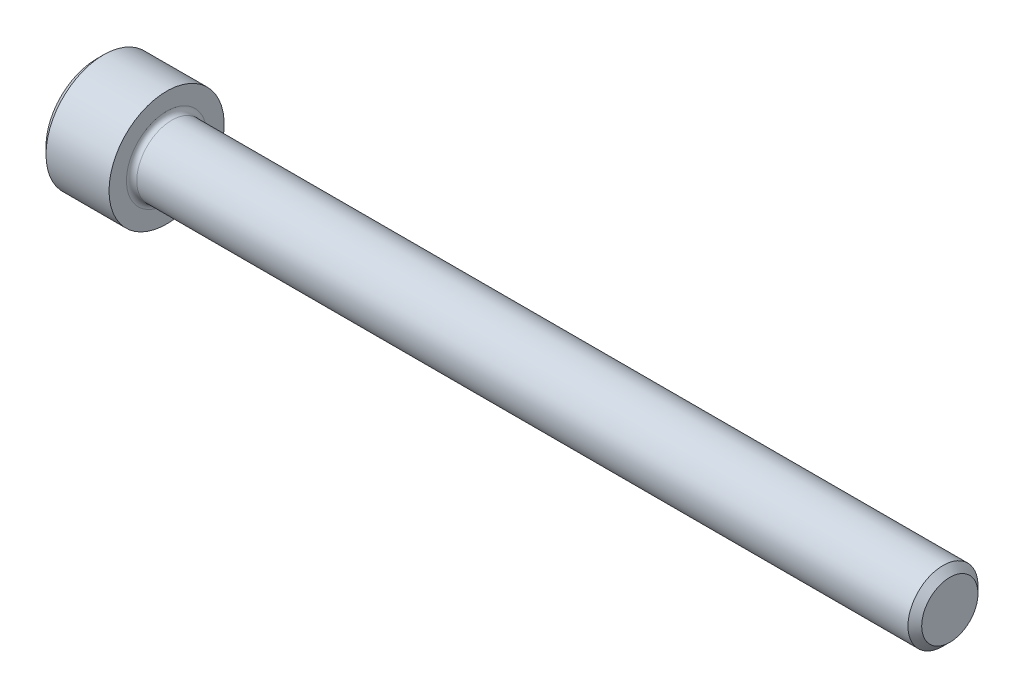
ISO-10303-21;
HEADER;
FILE_DESCRIPTION(('STEP AP214'),'2;1');
FILE_NAME('part.step','',(''),(''),'','','');
FILE_SCHEMA(('AUTOMOTIVE_DESIGN { 1 0 10303 214 1 1 1 1 }'));
ENDSEC;
DATA;
#1=APPLICATION_CONTEXT('core data for automotive mechanical design processes');
#2=APPLICATION_PROTOCOL_DEFINITION('international standard','automotive_design',2000,#1);
#3=PRODUCT_CONTEXT('',#1,'mechanical');
#4=PRODUCT('Part','Part','',(#3));
#5=PRODUCT_RELATED_PRODUCT_CATEGORY('part','',(#4));
#6=PRODUCT_DEFINITION_FORMATION('','',#4);
#7=PRODUCT_DEFINITION_CONTEXT('part definition',#1,'design');
#8=PRODUCT_DEFINITION('design','',#6,#7);
#9=PRODUCT_DEFINITION_SHAPE('','',#8);
#10=(LENGTH_UNIT() NAMED_UNIT(*) SI_UNIT(.MILLI.,.METRE.));
#11=(NAMED_UNIT(*) PLANE_ANGLE_UNIT() SI_UNIT($,.RADIAN.));
#12=(NAMED_UNIT(*) SI_UNIT($,.STERADIAN.) SOLID_ANGLE_UNIT());
#13=UNCERTAINTY_MEASURE_WITH_UNIT(LENGTH_MEASURE(1.E-05),#10,'distance_accuracy_value','');
#14=(GEOMETRIC_REPRESENTATION_CONTEXT(3) GLOBAL_UNCERTAINTY_ASSIGNED_CONTEXT((#13)) GLOBAL_UNIT_ASSIGNED_CONTEXT((#10,
#11,#12)) REPRESENTATION_CONTEXT('',''));
#15=CARTESIAN_POINT('',(0.,0.,0.));
#16=DIRECTION('',(0.,0.,1.));
#17=DIRECTION('',(1.,0.,0.));
#18=AXIS2_PLACEMENT_3D('',#15,#16,#17);
#19=CARTESIAN_POINT('',(2.286,-1.729383501,-1.98501));
#20=DIRECTION('',(-1.,0.,0.));
#21=DIRECTION('',(0.,0.,1.));
#22=AXIS2_PLACEMENT_3D('',#19,#20,#21);
#23=PLANE('',#22);
#24=DIRECTION('',(0.,-0.499999999964279,0.866025403805063));
#25=VECTOR('',#24,1.);
#26=CARTESIAN_POINT('',(2.286,-1.14604605735064,-1.98501));
#27=LINE('',#26,#25);
#28=CARTESIAN_POINT('',(2.286,-1.14604605767532,-1.98501));
#29=VERTEX_POINT('',#28);
#30=CARTESIAN_POINT('',(2.286,-1.71906908660764,-0.99250500002828));
#31=VERTEX_POINT('',#30);
#32=EDGE_CURVE('E20',#29,#31,#27,.T.);
#33=ORIENTED_EDGE('',*,*,#32,.T.);
#34=CARTESIAN_POINT('',(2.286,0.,0.));
#35=DIRECTION('',(-1.,0.,0.));
#36=DIRECTION('',(0.,0.,1.));
#37=AXIS2_PLACEMENT_3D('',#34,#35,#36);
#38=CIRCLE('',#37,1.98501);
#39=CARTESIAN_POINT('',(2.286,-3.81166474394743E-10,-1.98501));
#40=VERTEX_POINT('',#39);
#41=EDGE_CURVE('E87',#40,#31,#38,.T.);
#42=ORIENTED_EDGE('',*,*,#41,.F.);
#43=DIRECTION('',(0.,-1.,0.));
#44=VECTOR('',#43,1.);
#45=CARTESIAN_POINT('',(2.286,-0.859534543,-1.98501));
#46=LINE('',#45,#44);
#47=EDGE_CURVE('E83',#40,#29,#46,.T.);
#48=ORIENTED_EDGE('',*,*,#47,.T.);
#49=EDGE_LOOP('',(#33,#42,#48));
#50=FACE_BOUND('',#49,.T.);
#51=ADVANCED_FACE('F16',(#50),#23,.T.);
#52=CARTESIAN_POINT('',(2.286,-2.295530254,-1.00441506));
#53=DIRECTION('',(-1.,0.,0.));
#54=DIRECTION('',(0.,0.,1.));
#55=AXIS2_PLACEMENT_3D('',#52,#53,#54);
#56=PLANE('',#55);
#57=DIRECTION('',(0.,0.499999999825974,0.866025403884913));
#58=VECTOR('',#57,1.);
#59=CARTESIAN_POINT('',(2.286,-2.29209211568595,0.));
#60=LINE('',#59,#58);
#61=CARTESIAN_POINT('',(2.286,-2.29209211578409,3.39962631627323E-11));
#62=VERTEX_POINT('',#61);
#63=CARTESIAN_POINT('',(2.286,-1.71906908685505,0.992504999599751));
#64=VERTEX_POINT('',#63);
#65=EDGE_CURVE('E108',#62,#64,#60,.T.);
#66=ORIENTED_EDGE('',*,*,#65,.T.);
#67=CARTESIAN_POINT('',(2.286,0.,0.));
#68=DIRECTION('',(-1.,0.,0.));
#69=DIRECTION('',(0.,0.,1.));
#70=AXIS2_PLACEMENT_3D('',#67,#68,#69);
#71=CIRCLE('',#70,1.98501);
#72=EDGE_CURVE('E116',#31,#64,#71,.T.);
#73=ORIENTED_EDGE('',*,*,#72,.F.);
#74=DIRECTION('',(0.,-0.499999999825974,0.866025403884913));
#75=VECTOR('',#74,1.);
#76=CARTESIAN_POINT('',(2.286,-1.71906908731405,-0.992504999507718));
#77=LINE('',#76,#75);
#78=EDGE_CURVE('E106',#31,#62,#77,.T.);
#79=ORIENTED_EDGE('',*,*,#78,.T.);
#80=EDGE_LOOP('',(#66,#73,#79));
#81=FACE_BOUND('',#80,.T.);
#82=ADVANCED_FACE('F235',(#81),#56,.T.);
#83=CARTESIAN_POINT('',(2.286,-1.729383501,0.98654997));
#84=DIRECTION('',(-1.,0.,0.));
#85=DIRECTION('',(0.,0.,1.));
#86=AXIS2_PLACEMENT_3D('',#83,#84,#85);
#87=PLANE('',#86);
#88=DIRECTION('',(0.,1.,0.));
#89=VECTOR('',#88,1.);
#90=CARTESIAN_POINT('',(2.286,-0.859534543,1.98501));
#91=LINE('',#90,#89);
#92=CARTESIAN_POINT('',(2.286,-1.14604605767532,1.98501));
#93=VERTEX_POINT('',#92);
#94=CARTESIAN_POINT('',(2.286,-1.52275368124845E-10,1.98501));
#95=VERTEX_POINT('',#94);
#96=EDGE_CURVE('E114',#93,#95,#91,.T.);
#97=ORIENTED_EDGE('',*,*,#96,.T.);
#98=CARTESIAN_POINT('',(2.286,0.,0.));
#99=DIRECTION('',(-1.,0.,0.));
#100=DIRECTION('',(0.,0.,1.));
#101=AXIS2_PLACEMENT_3D('',#98,#99,#100);
#102=CIRCLE('',#101,1.98501);
#103=EDGE_CURVE('E119',#64,#95,#102,.T.);
#104=ORIENTED_EDGE('',*,*,#103,.F.);
#105=DIRECTION('',(0.,0.499999999964279,0.866025403805063));
#106=VECTOR('',#105,1.);
#107=CARTESIAN_POINT('',(2.286,-1.71906908605193,0.992505000287827));
#108=LINE('',#107,#106);
#109=EDGE_CURVE('E110',#64,#93,#108,.T.);
#110=ORIENTED_EDGE('',*,*,#109,.T.);
#111=EDGE_LOOP('',(#97,#104,#110));
#112=FACE_BOUND('',#111,.T.);
#113=ADVANCED_FACE('F238',(#112),#87,.T.);
#114=CARTESIAN_POINT('',(2.286,-0.010314415,0.98654997));
#115=DIRECTION('',(-1.,0.,0.));
#116=DIRECTION('',(0.,0.,1.));
#117=AXIS2_PLACEMENT_3D('',#114,#115,#116);
#118=PLANE('',#117);
#119=DIRECTION('',(0.,0.499999999964278,-0.866025403805063));
#120=VECTOR('',#119,1.);
#121=CARTESIAN_POINT('',(2.286,1.14604605735064,1.98501));
#122=LINE('',#121,#120);
#123=CARTESIAN_POINT('',(2.286,1.14604605767532,1.98501));
#124=VERTEX_POINT('',#123);
#125=CARTESIAN_POINT('',(2.286,1.71906908660764,0.992505000028279));
#126=VERTEX_POINT('',#125);
#127=EDGE_CURVE('E123',#124,#126,#122,.T.);
#128=ORIENTED_EDGE('',*,*,#127,.T.);
#129=CARTESIAN_POINT('',(2.286,0.,0.));
#130=DIRECTION('',(-1.,0.,0.));
#131=DIRECTION('',(0.,0.,1.));
#132=AXIS2_PLACEMENT_3D('',#129,#130,#131);
#133=CIRCLE('',#132,1.98501);
#134=EDGE_CURVE('E129',#95,#126,#133,.T.);
#135=ORIENTED_EDGE('',*,*,#134,.F.);
#136=DIRECTION('',(0.,1.,0.));
#137=VECTOR('',#136,1.);
#138=CARTESIAN_POINT('',(2.286,0.859534543,1.98501));
#139=LINE('',#138,#137);
#140=EDGE_CURVE('E122',#95,#124,#139,.T.);
#141=ORIENTED_EDGE('',*,*,#140,.T.);
#142=EDGE_LOOP('',(#128,#135,#141));
#143=FACE_BOUND('',#142,.T.);
#144=ADVANCED_FACE('F241',(#143),#118,.T.);
#145=CARTESIAN_POINT('',(2.286,1.715630949,-1.00441506));
#146=DIRECTION('',(-1.,0.,0.));
#147=DIRECTION('',(0.,0.,1.));
#148=AXIS2_PLACEMENT_3D('',#145,#146,#147);
#149=PLANE('',#148);
#150=DIRECTION('',(0.,-0.499999999825974,-0.866025403884913));
#151=VECTOR('',#150,1.);
#152=CARTESIAN_POINT('',(2.286,2.29209211568595,0.));
#153=LINE('',#152,#151);
#154=CARTESIAN_POINT('',(2.286,2.29209211578409,-3.39963652931999E-11));
#155=VERTEX_POINT('',#154);
#156=CARTESIAN_POINT('',(2.286,1.71906908701974,-0.992504999763296));
#157=VERTEX_POINT('',#156);
#158=EDGE_CURVE('E127',#155,#157,#153,.T.);
#159=ORIENTED_EDGE('',*,*,#158,.T.);
#160=CARTESIAN_POINT('',(2.286,0.,0.));
#161=DIRECTION('',(-1.,0.,0.));
#162=DIRECTION('',(0.,0.,1.));
#163=AXIS2_PLACEMENT_3D('',#160,#161,#162);
#164=CIRCLE('',#163,1.98501);
#165=EDGE_CURVE('E132',#126,#157,#164,.T.);
#166=ORIENTED_EDGE('',*,*,#165,.F.);
#167=DIRECTION('',(0.,0.499999999825974,-0.866025403884913));
#168=VECTOR('',#167,1.);
#169=CARTESIAN_POINT('',(2.286,1.71906908731405,0.992504999507718));
#170=LINE('',#169,#168);
#171=EDGE_CURVE('E125',#126,#155,#170,.T.);
#172=ORIENTED_EDGE('',*,*,#171,.T.);
#173=EDGE_LOOP('',(#159,#166,#172));
#174=FACE_BOUND('',#173,.T.);
#175=ADVANCED_FACE('F231',(#174),#149,.T.);
#176=CARTESIAN_POINT('',(3.432046058,0.,0.));
#177=DIRECTION('',(-1.,0.,0.));
#178=DIRECTION('',(0.,0.,1.));
#179=AXIS2_PLACEMENT_3D('',#176,#177,#178);
#180=CONICAL_SURFACE('',#179,0.,1.04719755113769);
#181=CARTESIAN_POINT('',(3.432046058,0.,0.));
#182=VERTEX_POINT('',#181);
#183=VERTEX_LOOP('',#182);
#184=FACE_BOUND('',#183,.T.);
#185=ORIENTED_EDGE('',*,*,#165,.T.);
#186=CARTESIAN_POINT('',(2.286,0.,0.));
#187=DIRECTION('',(-1.,0.,0.));
#188=DIRECTION('',(0.,0.,1.));
#189=AXIS2_PLACEMENT_3D('',#186,#187,#188);
#190=CIRCLE('',#189,1.98501);
#191=EDGE_CURVE('E135',#40,#157,#190,.F.);
#192=ORIENTED_EDGE('',*,*,#191,.F.);
#193=ORIENTED_EDGE('',*,*,#41,.T.);
#194=ORIENTED_EDGE('',*,*,#72,.T.);
#195=ORIENTED_EDGE('',*,*,#103,.T.);
#196=ORIENTED_EDGE('',*,*,#134,.T.);
#197=EDGE_LOOP('',(#185,#192,#193,#194,#195,#196));
#198=FACE_BOUND('',#197,.T.);
#199=ADVANCED_FACE('F227',(#184,#198),#180,.F.);
#200=CARTESIAN_POINT('',(2.286,-0.010314415,-1.98501));
#201=DIRECTION('',(-1.,0.,0.));
#202=DIRECTION('',(0.,0.,1.));
#203=AXIS2_PLACEMENT_3D('',#200,#201,#202);
#204=PLANE('',#203);
#205=DIRECTION('',(0.,-1.,0.));
#206=VECTOR('',#205,1.);
#207=CARTESIAN_POINT('',(2.286,0.,-1.98501));
#208=LINE('',#207,#206);
#209=CARTESIAN_POINT('',(2.286,1.14604605789177,-1.98501));
#210=VERTEX_POINT('',#209);
#211=EDGE_CURVE('E138',#210,#40,#208,.T.);
#212=ORIENTED_EDGE('',*,*,#211,.T.);
#213=ORIENTED_EDGE('',*,*,#191,.T.);
#214=DIRECTION('',(0.,-0.500000000051013,-0.866025403754986));
#215=VECTOR('',#214,1.);
#216=CARTESIAN_POINT('',(2.286,1.719069087,-0.992505));
#217=LINE('',#216,#215);
#218=EDGE_CURVE('E176',#157,#210,#217,.T.);
#219=ORIENTED_EDGE('',*,*,#218,.T.);
#220=EDGE_LOOP('',(#212,#213,#219));
#221=FACE_BOUND('',#220,.T.);
#222=ADVANCED_FACE('F230',(#221),#204,.T.);
#223=CARTESIAN_POINT('',(0.,-1.146046058,-1.98501));
#224=DIRECTION('',(0.,0.,-1.));
#225=DIRECTION('',(0.,1.,0.));
#226=AXIS2_PLACEMENT_3D('',#223,#224,#225);
#227=PLANE('',#226);
#228=ORIENTED_EDGE('',*,*,#47,.F.);
#229=ORIENTED_EDGE('',*,*,#211,.F.);
#230=DIRECTION('',(-1.,0.,0.));
#231=VECTOR('',#230,1.);
#232=CARTESIAN_POINT('',(1.143,1.146046058,-1.98501));
#233=LINE('',#232,#231);
#234=CARTESIAN_POINT('',(0.,1.14604605678512,-1.98501000094996));
#235=VERTEX_POINT('',#234);
#236=EDGE_CURVE('E170',#210,#235,#233,.T.);
#237=ORIENTED_EDGE('',*,*,#236,.T.);
#238=DIRECTION('',(0.,1.,0.));
#239=VECTOR('',#238,1.);
#240=CARTESIAN_POINT('',(0.,0.,-1.9850100020923));
#241=LINE('',#240,#239);
#242=CARTESIAN_POINT('',(0.,-1.14604605678512,-1.98501000094996));
#243=VERTEX_POINT('',#242);
#244=EDGE_CURVE('E97',#243,#235,#241,.T.);
#245=ORIENTED_EDGE('',*,*,#244,.F.);
#246=DIRECTION('',(-1.,0.,0.));
#247=VECTOR('',#246,1.);
#248=CARTESIAN_POINT('',(1.143,-1.146046058,-1.98501));
#249=LINE('',#248,#247);
#250=EDGE_CURVE('E94',#29,#243,#249,.T.);
#251=ORIENTED_EDGE('',*,*,#250,.F.);
#252=EDGE_LOOP('',(#228,#229,#237,#245,#251));
#253=FACE_BOUND('',#252,.T.);
#254=ADVANCED_FACE('F95',(#253),#227,.F.);
#255=CARTESIAN_POINT('',(0.,1.146046058,-1.98501));
#256=DIRECTION('',(0.,0.866025403754987,-0.500000000051013));
#257=DIRECTION('',(0.,0.500000000051013,0.866025403754987));
#258=AXIS2_PLACEMENT_3D('',#255,#256,#257);
#259=PLANE('',#258);
#260=ORIENTED_EDGE('',*,*,#218,.F.);
#261=ORIENTED_EDGE('',*,*,#158,.F.);
#262=DIRECTION('',(1.,0.,0.));
#263=VECTOR('',#262,1.);
#264=CARTESIAN_POINT('',(1.143,2.292092116,0.));
#265=LINE('',#264,#263);
#266=CARTESIAN_POINT('',(0.,2.29209211796823,-3.09916046818681E-10));
#267=VERTEX_POINT('',#266);
#268=EDGE_CURVE('E167',#267,#155,#265,.T.);
#269=ORIENTED_EDGE('',*,*,#268,.F.);
#270=DIRECTION('',(0.,0.500000001278527,0.866025403046281));
#271=VECTOR('',#270,1.);
#272=CARTESIAN_POINT('',(0.,1.14604605590346,-1.9850100020923));
#273=LINE('',#272,#271);
#274=EDGE_CURVE('E139',#235,#267,#273,.T.);
#275=ORIENTED_EDGE('',*,*,#274,.F.);
#276=ORIENTED_EDGE('',*,*,#236,.F.);
#277=EDGE_LOOP('',(#260,#261,#269,#275,#276));
#278=FACE_BOUND('',#277,.T.);
#279=ADVANCED_FACE('F254',(#278),#259,.F.);
#280=CARTESIAN_POINT('',(0.,1.146046058,1.98501));
#281=DIRECTION('',(0.,-0.866025403754987,-0.500000000051013));
#282=DIRECTION('',(0.,0.500000000051013,-0.866025403754987));
#283=AXIS2_PLACEMENT_3D('',#280,#281,#282);
#284=PLANE('',#283);
#285=ORIENTED_EDGE('',*,*,#268,.T.);
#286=ORIENTED_EDGE('',*,*,#171,.F.);
#287=ORIENTED_EDGE('',*,*,#127,.F.);
#288=DIRECTION('',(-1.,0.,0.));
#289=VECTOR('',#288,1.);
#290=CARTESIAN_POINT('',(1.143,1.146046058,1.98501));
#291=LINE('',#290,#289);
#292=CARTESIAN_POINT('',(0.,1.14604605678512,1.98501000094996));
#293=VERTEX_POINT('',#292);
#294=EDGE_CURVE('E162',#124,#293,#291,.T.);
#295=ORIENTED_EDGE('',*,*,#294,.T.);
#296=DIRECTION('',(0.,-0.500000001278527,0.866025403046281));
#297=VECTOR('',#296,1.);
#298=CARTESIAN_POINT('',(0.,2.29209211886288,0.));
#299=LINE('',#298,#297);
#300=EDGE_CURVE('E141',#267,#293,#299,.T.);
#301=ORIENTED_EDGE('',*,*,#300,.F.);
#302=EDGE_LOOP('',(#285,#286,#287,#295,#301));
#303=FACE_BOUND('',#302,.T.);
#304=ADVANCED_FACE('F257',(#303),#284,.T.);
#305=CARTESIAN_POINT('',(0.,1.146046058,1.98501));
#306=DIRECTION('',(0.,0.,1.));
#307=DIRECTION('',(0.,-1.,0.));
#308=AXIS2_PLACEMENT_3D('',#305,#306,#307);
#309=PLANE('',#308);
#310=ORIENTED_EDGE('',*,*,#140,.F.);
#311=ORIENTED_EDGE('',*,*,#96,.F.);
#312=DIRECTION('',(1.,0.,0.));
#313=VECTOR('',#312,1.);
#314=CARTESIAN_POINT('',(1.143,-1.146046058,1.98501));
#315=LINE('',#314,#313);
#316=CARTESIAN_POINT('',(0.,-1.14604605678512,1.98501000094996));
#317=VERTEX_POINT('',#316);
#318=EDGE_CURVE('E101',#317,#93,#315,.T.);
#319=ORIENTED_EDGE('',*,*,#318,.F.);
#320=DIRECTION('',(0.,-1.,0.));
#321=VECTOR('',#320,1.);
#322=CARTESIAN_POINT('',(0.,0.,1.9850100020923));
#323=LINE('',#322,#321);
#324=EDGE_CURVE('E143',#293,#317,#323,.T.);
#325=ORIENTED_EDGE('',*,*,#324,.F.);
#326=ORIENTED_EDGE('',*,*,#294,.F.);
#327=EDGE_LOOP('',(#310,#311,#319,#325,#326));
#328=FACE_BOUND('',#327,.T.);
#329=ADVANCED_FACE('F261',(#328),#309,.F.);
#330=CARTESIAN_POINT('',(0.,-2.292092116,0.));
#331=DIRECTION('',(0.,0.866025403754987,-0.500000000051013));
#332=DIRECTION('',(0.,0.500000000051013,0.866025403754987));
#333=AXIS2_PLACEMENT_3D('',#330,#331,#332);
#334=PLANE('',#333);
#335=ORIENTED_EDGE('',*,*,#318,.T.);
#336=ORIENTED_EDGE('',*,*,#109,.F.);
#337=ORIENTED_EDGE('',*,*,#65,.F.);
#338=DIRECTION('',(1.,0.,0.));
#339=VECTOR('',#338,1.);
#340=CARTESIAN_POINT('',(1.143,-2.292092116,0.));
#341=LINE('',#340,#339);
#342=CARTESIAN_POINT('',(0.,-2.29209211796823,-3.09915573733553E-10));
#343=VERTEX_POINT('',#342);
#344=EDGE_CURVE('E100',#343,#62,#341,.T.);
#345=ORIENTED_EDGE('',*,*,#344,.F.);
#346=DIRECTION('',(0.,-0.500000001278527,-0.866025403046281));
#347=VECTOR('',#346,1.);
#348=CARTESIAN_POINT('',(0.,-1.14604605590346,1.9850100020923));
#349=LINE('',#348,#347);
#350=EDGE_CURVE('E35',#317,#343,#349,.T.);
#351=ORIENTED_EDGE('',*,*,#350,.F.);
#352=EDGE_LOOP('',(#335,#336,#337,#345,#351));
#353=FACE_BOUND('',#352,.T.);
#354=ADVANCED_FACE('F265',(#353),#334,.T.);
#355=CARTESIAN_POINT('',(0.,-1.146046058,-1.98501));
#356=DIRECTION('',(0.,0.866025403754987,0.500000000051013));
#357=DIRECTION('',(0.,-0.500000000051013,0.866025403754987));
#358=AXIS2_PLACEMENT_3D('',#355,#356,#357);
#359=PLANE('',#358);
#360=ORIENTED_EDGE('',*,*,#344,.T.);
#361=ORIENTED_EDGE('',*,*,#78,.F.);
#362=ORIENTED_EDGE('',*,*,#32,.F.);
#363=ORIENTED_EDGE('',*,*,#250,.T.);
#364=DIRECTION('',(0.,0.500000001278527,-0.866025403046281));
#365=VECTOR('',#364,1.);
#366=CARTESIAN_POINT('',(0.,-2.29209211886288,0.));
#367=LINE('',#366,#365);
#368=EDGE_CURVE('E145',#343,#243,#367,.T.);
#369=ORIENTED_EDGE('',*,*,#368,.F.);
#370=EDGE_LOOP('',(#360,#361,#362,#363,#369));
#371=FACE_BOUND('',#370,.T.);
#372=ADVANCED_FACE('F105',(#371),#359,.T.);
#373=CARTESIAN_POINT('',(0.,-3.5279838,-3.5279838));
#374=DIRECTION('',(-1.,0.,0.));
#375=DIRECTION('',(0.,0.,1.));
#376=AXIS2_PLACEMENT_3D('',#373,#374,#375);
#377=PLANE('',#376);
#378=ORIENTED_EDGE('',*,*,#350,.T.);
#379=ORIENTED_EDGE('',*,*,#368,.T.);
#380=ORIENTED_EDGE('',*,*,#244,.T.);
#381=ORIENTED_EDGE('',*,*,#274,.T.);
#382=ORIENTED_EDGE('',*,*,#300,.T.);
#383=ORIENTED_EDGE('',*,*,#324,.T.);
#384=EDGE_LOOP('',(#378,#379,#380,#381,#382,#383));
#385=FACE_BOUND('',#384,.T.);
#386=CARTESIAN_POINT('',(0.,0.,0.));
#387=DIRECTION('',(1.,0.,0.));
#388=DIRECTION('',(0.,0.,-1.));
#389=AXIS2_PLACEMENT_3D('',#386,#387,#388);
#390=CIRCLE('',#389,3.48615);
#391=CARTESIAN_POINT('',(0.,0.,-3.48615));
#392=VERTEX_POINT('',#391);
#393=EDGE_CURVE('E147',#392,#392,#390,.F.);
#394=ORIENTED_EDGE('',*,*,#393,.T.);
#395=EDGE_LOOP('',(#394));
#396=FACE_BOUND('',#395,.T.);
#397=ADVANCED_FACE('F272',(#385,#396),#377,.T.);
#398=CARTESIAN_POINT('',(58.801,-1.96384672,1.96384672));
#399=DIRECTION('',(1.,0.,0.));
#400=DIRECTION('',(0.,0.,-1.));
#401=AXIS2_PLACEMENT_3D('',#398,#399,#400);
#402=PLANE('',#401);
#403=CARTESIAN_POINT('',(58.801,0.,0.));
#404=DIRECTION('',(-1.,0.,0.));
#405=DIRECTION('',(0.,0.,1.));
#406=AXIS2_PLACEMENT_3D('',#403,#404,#405);
#407=CIRCLE('',#406,1.94056);
#408=CARTESIAN_POINT('',(58.801,0.,1.94056));
#409=VERTEX_POINT('',#408);
#410=EDGE_CURVE('E150',#409,#409,#407,.F.);
#411=ORIENTED_EDGE('',*,*,#410,.T.);
#412=EDGE_LOOP('',(#411));
#413=FACE_BOUND('',#412,.T.);
#414=ADVANCED_FACE('F225',(#413),#402,.T.);
#415=CARTESIAN_POINT('',(0.,0.,0.));
#416=DIRECTION('',(1.,0.,0.));
#417=DIRECTION('',(0.,0.,-1.));
#418=AXIS2_PLACEMENT_3D('',#415,#416,#417);
#419=CONICAL_SURFACE('',#418,3.48615,0.785398163397448);
#420=CARTESIAN_POINT('',(0.4826,0.,0.));
#421=DIRECTION('',(-1.,0.,0.));
#422=DIRECTION('',(0.,-1.,0.));
#423=AXIS2_PLACEMENT_3D('',#420,#421,#422);
#424=CIRCLE('',#423,3.96875);
#425=CARTESIAN_POINT('',(0.4826,-3.96875,0.));
#426=VERTEX_POINT('',#425);
#427=EDGE_CURVE('E153',#426,#426,#424,.T.);
#428=ORIENTED_EDGE('',*,*,#427,.T.);
#429=EDGE_LOOP('',(#428));
#430=FACE_BOUND('',#429,.T.);
#431=ORIENTED_EDGE('',*,*,#393,.F.);
#432=EDGE_LOOP('',(#431));
#433=FACE_BOUND('',#432,.T.);
#434=ADVANCED_FACE('F218',(#430,#433),#419,.T.);
#435=CARTESIAN_POINT('',(58.801,0.,0.));
#436=DIRECTION('',(-1.,0.,0.));
#437=DIRECTION('',(0.,0.,1.));
#438=AXIS2_PLACEMENT_3D('',#435,#436,#437);
#439=CONICAL_SURFACE('',#438,1.94056,0.785398163397451);
#440=CARTESIAN_POINT('',(58.32856,0.,0.));
#441=DIRECTION('',(-1.,0.,0.));
#442=DIRECTION('',(0.,-1.,0.));
#443=AXIS2_PLACEMENT_3D('',#440,#441,#442);
#444=CIRCLE('',#443,2.413);
#445=CARTESIAN_POINT('',(58.32856,-2.413,0.));
#446=VERTEX_POINT('',#445);
#447=EDGE_CURVE('E156',#446,#446,#444,.F.);
#448=ORIENTED_EDGE('',*,*,#447,.T.);
#449=EDGE_LOOP('',(#448));
#450=FACE_BOUND('',#449,.T.);
#451=ORIENTED_EDGE('',*,*,#410,.F.);
#452=EDGE_LOOP('',(#451));
#453=FACE_BOUND('',#452,.T.);
#454=ADVANCED_FACE('F210',(#450,#453),#439,.T.);
#455=CARTESIAN_POINT('',(4.826,0.,0.));
#456=DIRECTION('',(-1.,0.,0.));
#457=DIRECTION('',(0.,0.,1.));
#458=AXIS2_PLACEMENT_3D('',#455,#456,#457);
#459=CYLINDRICAL_SURFACE('',#458,3.96875);
#460=ORIENTED_EDGE('',*,*,#427,.F.);
#461=EDGE_LOOP('',(#460));
#462=FACE_BOUND('',#461,.T.);
#463=CARTESIAN_POINT('',(4.826,0.,0.));
#464=DIRECTION('',(-1.,0.,0.));
#465=DIRECTION('',(0.,0.,1.));
#466=AXIS2_PLACEMENT_3D('',#463,#464,#465);
#467=CIRCLE('',#466,3.96875);
#468=CARTESIAN_POINT('',(4.826,0.,3.96875));
#469=VERTEX_POINT('',#468);
#470=EDGE_CURVE('E154',#469,#469,#467,.F.);
#471=ORIENTED_EDGE('',*,*,#470,.F.);
#472=EDGE_LOOP('',(#471));
#473=FACE_BOUND('',#472,.T.);
#474=ADVANCED_FACE('F208',(#462,#473),#459,.T.);
#475=CARTESIAN_POINT('',(58.32856,0.,0.));
#476=DIRECTION('',(-1.,0.,0.));
#477=DIRECTION('',(0.,0.,1.));
#478=AXIS2_PLACEMENT_3D('',#475,#476,#477);
#479=CYLINDRICAL_SURFACE('',#478,2.413);
#480=CARTESIAN_POINT('',(5.1816,0.,0.));
#481=DIRECTION('',(1.,0.,0.));
#482=DIRECTION('',(0.,0.,-1.));
#483=AXIS2_PLACEMENT_3D('',#480,#481,#482);
#484=CIRCLE('',#483,2.413);
#485=CARTESIAN_POINT('',(5.1816,0.,-2.413));
#486=VERTEX_POINT('',#485);
#487=EDGE_CURVE('E26',#486,#486,#484,.T.);
#488=ORIENTED_EDGE('',*,*,#487,.T.);
#489=EDGE_LOOP('',(#488));
#490=FACE_BOUND('',#489,.T.);
#491=ORIENTED_EDGE('',*,*,#447,.F.);
#492=EDGE_LOOP('',(#491));
#493=FACE_BOUND('',#492,.T.);
#494=ADVANCED_FACE('F193',(#490,#493),#479,.T.);
#495=CARTESIAN_POINT('',(4.826,-4.016375,4.016375));
#496=DIRECTION('',(1.,0.,0.));
#497=DIRECTION('',(0.,0.,-1.));
#498=AXIS2_PLACEMENT_3D('',#495,#496,#497);
#499=PLANE('',#498);
#500=CARTESIAN_POINT('',(4.826,0.,0.));
#501=DIRECTION('',(1.,0.,0.));
#502=DIRECTION('',(0.,0.,-1.));
#503=AXIS2_PLACEMENT_3D('',#500,#501,#502);
#504=CIRCLE('',#503,2.7686);
#505=CARTESIAN_POINT('',(4.826,0.,-2.7686));
#506=VERTEX_POINT('',#505);
#507=EDGE_CURVE('E11',#506,#506,#504,.F.);
#508=ORIENTED_EDGE('',*,*,#507,.T.);
#509=EDGE_LOOP('',(#508));
#510=FACE_BOUND('',#509,.T.);
#511=ORIENTED_EDGE('',*,*,#470,.T.);
#512=EDGE_LOOP('',(#511));
#513=FACE_BOUND('',#512,.T.);
#514=ADVANCED_FACE('F197',(#510,#513),#499,.T.);
#515=CARTESIAN_POINT('',(5.1816,0.,0.));
#516=DIRECTION('',(1.,0.,0.));
#517=DIRECTION('',(0.,0.,-1.));
#518=AXIS2_PLACEMENT_3D('',#515,#516,#517);
#519=TOROIDAL_SURFACE('',#518,2.7686,0.355600000000001);
#520=ORIENTED_EDGE('',*,*,#507,.F.);
#521=EDGE_LOOP('',(#520));
#522=FACE_BOUND('',#521,.T.);
#523=ORIENTED_EDGE('',*,*,#487,.F.);
#524=EDGE_LOOP('',(#523));
#525=FACE_BOUND('',#524,.T.);
#526=ADVANCED_FACE('F18',(#522,#525),#519,.F.);
#527=CLOSED_SHELL('',(#51,#82,#113,#144,#175,#199,#222,#254,#279,#304,#329,#354,#372,#397,#414,
#434,#454,#474,#494,#514,#526));
#528=MANIFOLD_SOLID_BREP('B1',#527);
#529=ADVANCED_BREP_SHAPE_REPRESENTATION('',(#18,#528),#14);
#530=SHAPE_DEFINITION_REPRESENTATION(#9,#529);
ENDSEC;
END-ISO-10303-21;
